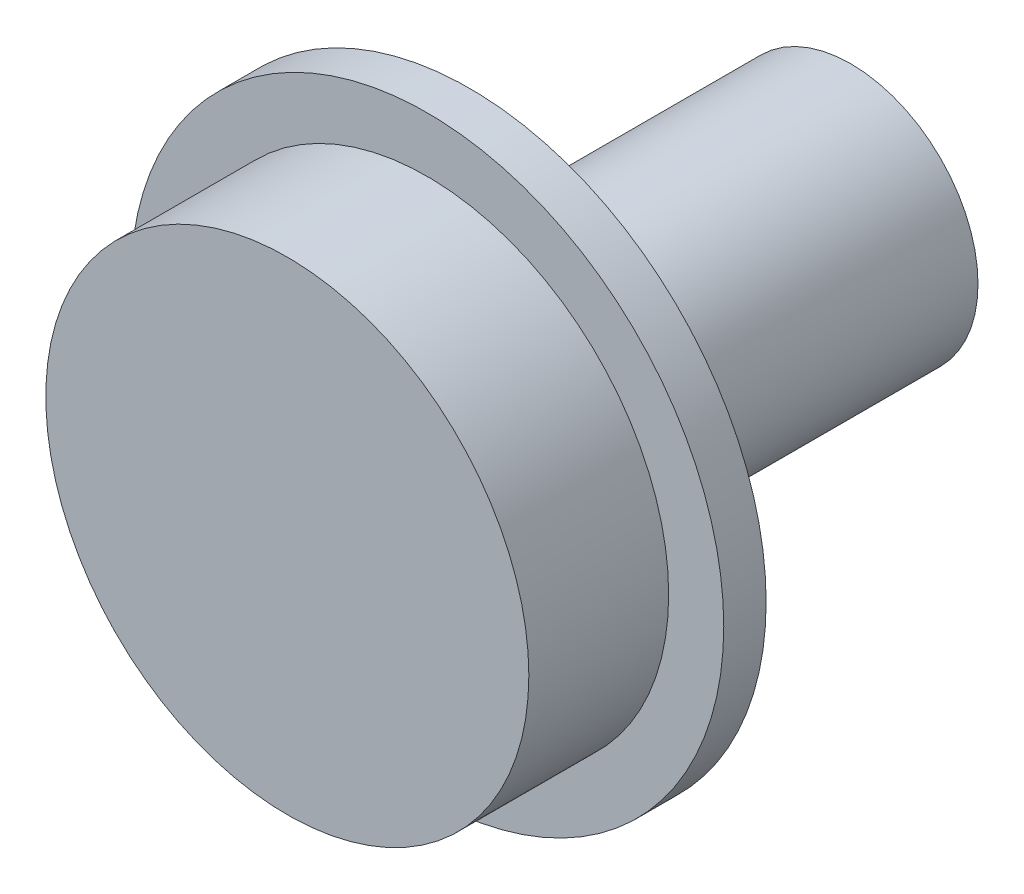
ISO-10303-21;
HEADER;
FILE_DESCRIPTION(('STEP AP214'),'2;1');
FILE_NAME('part.step','',(''),(''),'','','');
FILE_SCHEMA(('AUTOMOTIVE_DESIGN { 1 0 10303 214 1 1 1 1 }'));
ENDSEC;
DATA;
#1=APPLICATION_CONTEXT('core data for automotive mechanical design processes');
#2=APPLICATION_PROTOCOL_DEFINITION('international standard','automotive_design',2000,#1);
#3=PRODUCT_CONTEXT('',#1,'mechanical');
#4=PRODUCT('Part','Part','',(#3));
#5=PRODUCT_RELATED_PRODUCT_CATEGORY('part','',(#4));
#6=PRODUCT_DEFINITION_FORMATION('','',#4);
#7=PRODUCT_DEFINITION_CONTEXT('part definition',#1,'design');
#8=PRODUCT_DEFINITION('design','',#6,#7);
#9=PRODUCT_DEFINITION_SHAPE('','',#8);
#10=(LENGTH_UNIT() NAMED_UNIT(*) SI_UNIT(.MILLI.,.METRE.));
#11=(NAMED_UNIT(*) PLANE_ANGLE_UNIT() SI_UNIT($,.RADIAN.));
#12=(NAMED_UNIT(*) SI_UNIT($,.STERADIAN.) SOLID_ANGLE_UNIT());
#13=UNCERTAINTY_MEASURE_WITH_UNIT(LENGTH_MEASURE(1.E-05),#10,'distance_accuracy_value','');
#14=(GEOMETRIC_REPRESENTATION_CONTEXT(3) GLOBAL_UNCERTAINTY_ASSIGNED_CONTEXT((#13)) GLOBAL_UNIT_ASSIGNED_CONTEXT((#10,
#11,#12)) REPRESENTATION_CONTEXT('',''));
#15=CARTESIAN_POINT('',(0.,0.,0.));
#16=DIRECTION('',(0.,0.,1.));
#17=DIRECTION('',(1.,0.,0.));
#18=AXIS2_PLACEMENT_3D('',#15,#16,#17);
#19=CARTESIAN_POINT('',(0.,0.,0.5));
#20=DIRECTION('',(0.,0.,1.));
#21=DIRECTION('',(1.,0.,0.));
#22=AXIS2_PLACEMENT_3D('',#19,#20,#21);
#23=PLANE('',#22);
#24=CARTESIAN_POINT('',(0.,0.,0.5));
#25=DIRECTION('',(0.,0.,1.));
#26=DIRECTION('',(1.,0.,0.));
#27=AXIS2_PLACEMENT_3D('',#24,#25,#26);
#28=CIRCLE('',#27,1.5);
#29=CARTESIAN_POINT('',(1.5,0.,0.5));
#30=VERTEX_POINT('',#29);
#31=EDGE_CURVE('E44',#30,#30,#28,.T.);
#32=ORIENTED_EDGE('',*,*,#31,.T.);
#33=EDGE_LOOP('',(#32));
#34=FACE_BOUND('',#33,.T.);
#35=CARTESIAN_POINT('',(0.,0.,0.5));
#36=DIRECTION('',(0.,0.,1.));
#37=DIRECTION('',(1.,0.,0.));
#38=AXIS2_PLACEMENT_3D('',#35,#36,#37);
#39=CIRCLE('',#38,1.7);
#40=CARTESIAN_POINT('',(1.7,0.,0.5));
#41=VERTEX_POINT('',#40);
#42=EDGE_CURVE('E61',#41,#41,#39,.T.);
#43=ORIENTED_EDGE('',*,*,#42,.F.);
#44=EDGE_LOOP('',(#43));
#45=FACE_BOUND('',#44,.T.);
#46=ADVANCED_FACE('F37',(#34,#45),#23,.F.);
#47=CARTESIAN_POINT('',(0.,0.,0.5));
#48=DIRECTION('',(0.,0.,-1.));
#49=DIRECTION('',(-1.,0.,0.));
#50=AXIS2_PLACEMENT_3D('',#47,#48,#49);
#51=CYLINDRICAL_SURFACE('',#50,1.5);
#52=ORIENTED_EDGE('',*,*,#31,.F.);
#53=EDGE_LOOP('',(#52));
#54=FACE_BOUND('',#53,.T.);
#55=CARTESIAN_POINT('',(0.,0.,-4.5));
#56=DIRECTION('',(0.,0.,1.));
#57=DIRECTION('',(1.,0.,0.));
#58=AXIS2_PLACEMENT_3D('',#55,#56,#57);
#59=CIRCLE('',#58,1.5);
#60=CARTESIAN_POINT('',(1.5,0.,-4.5));
#61=VERTEX_POINT('',#60);
#62=EDGE_CURVE('E48',#61,#61,#59,.T.);
#63=ORIENTED_EDGE('',*,*,#62,.T.);
#64=EDGE_LOOP('',(#63));
#65=FACE_BOUND('',#64,.T.);
#66=ADVANCED_FACE('F74',(#54,#65),#51,.T.);
#67=CARTESIAN_POINT('',(0.,0.,-4.5));
#68=DIRECTION('',(0.,0.,1.));
#69=DIRECTION('',(1.,0.,0.));
#70=AXIS2_PLACEMENT_3D('',#67,#68,#69);
#71=PLANE('',#70);
#72=ORIENTED_EDGE('',*,*,#62,.F.);
#73=EDGE_LOOP('',(#72));
#74=FACE_BOUND('',#73,.T.);
#75=ADVANCED_FACE('F80',(#74),#71,.F.);
#76=CARTESIAN_POINT('',(0.,0.,0.5));
#77=DIRECTION('',(0.,0.,1.));
#78=DIRECTION('',(1.,0.,0.));
#79=AXIS2_PLACEMENT_3D('',#76,#77,#78);
#80=PLANE('',#79);
#81=CARTESIAN_POINT('',(0.,0.,0.5));
#82=DIRECTION('',(0.,0.,1.));
#83=DIRECTION('',(1.,0.,0.));
#84=AXIS2_PLACEMENT_3D('',#81,#82,#83);
#85=CIRCLE('',#84,2.85);
#86=CARTESIAN_POINT('',(2.85,0.,0.5));
#87=VERTEX_POINT('',#86);
#88=EDGE_CURVE('E53',#87,#87,#85,.T.);
#89=ORIENTED_EDGE('',*,*,#88,.F.);
#90=EDGE_LOOP('',(#89));
#91=FACE_BOUND('',#90,.T.);
#92=CARTESIAN_POINT('',(0.,0.,0.5));
#93=DIRECTION('',(0.,0.,1.));
#94=DIRECTION('',(1.,0.,0.));
#95=AXIS2_PLACEMENT_3D('',#92,#93,#94);
#96=CIRCLE('',#95,3.5);
#97=CARTESIAN_POINT('',(3.5,0.,0.5));
#98=VERTEX_POINT('',#97);
#99=EDGE_CURVE('E57',#98,#98,#96,.T.);
#100=ORIENTED_EDGE('',*,*,#99,.T.);
#101=EDGE_LOOP('',(#100));
#102=FACE_BOUND('',#101,.T.);
#103=ADVANCED_FACE('F88',(#91,#102),#80,.T.);
#104=CARTESIAN_POINT('',(0.,0.,0.));
#105=DIRECTION('',(0.,0.,1.));
#106=DIRECTION('',(1.,0.,0.));
#107=AXIS2_PLACEMENT_3D('',#104,#105,#106);
#108=PLANE('',#107);
#109=CARTESIAN_POINT('',(0.,0.,0.));
#110=DIRECTION('',(0.,0.,1.));
#111=DIRECTION('',(1.,0.,0.));
#112=AXIS2_PLACEMENT_3D('',#109,#110,#111);
#113=CIRCLE('',#112,3.5);
#114=CARTESIAN_POINT('',(3.5,0.,0.));
#115=VERTEX_POINT('',#114);
#116=EDGE_CURVE('E58',#115,#115,#113,.T.);
#117=ORIENTED_EDGE('',*,*,#116,.F.);
#118=EDGE_LOOP('',(#117));
#119=FACE_BOUND('',#118,.T.);
#120=CARTESIAN_POINT('',(0.,0.,0.));
#121=DIRECTION('',(0.,0.,1.));
#122=DIRECTION('',(1.,0.,0.));
#123=AXIS2_PLACEMENT_3D('',#120,#121,#122);
#124=CIRCLE('',#123,1.7);
#125=CARTESIAN_POINT('',(1.7,0.,0.));
#126=VERTEX_POINT('',#125);
#127=EDGE_CURVE('E64',#126,#126,#124,.T.);
#128=ORIENTED_EDGE('',*,*,#127,.T.);
#129=EDGE_LOOP('',(#128));
#130=FACE_BOUND('',#129,.T.);
#131=ADVANCED_FACE('F93',(#119,#130),#108,.F.);
#132=CARTESIAN_POINT('',(0.,0.,0.5));
#133=DIRECTION('',(0.,0.,-1.));
#134=DIRECTION('',(-1.,0.,0.));
#135=AXIS2_PLACEMENT_3D('',#132,#133,#134);
#136=CYLINDRICAL_SURFACE('',#135,3.5);
#137=ORIENTED_EDGE('',*,*,#99,.F.);
#138=EDGE_LOOP('',(#137));
#139=FACE_BOUND('',#138,.T.);
#140=ORIENTED_EDGE('',*,*,#116,.T.);
#141=EDGE_LOOP('',(#140));
#142=FACE_BOUND('',#141,.T.);
#143=ADVANCED_FACE('F90',(#139,#142),#136,.T.);
#144=CARTESIAN_POINT('',(0.,0.,0.5));
#145=DIRECTION('',(0.,0.,-1.));
#146=DIRECTION('',(-1.,0.,0.));
#147=AXIS2_PLACEMENT_3D('',#144,#145,#146);
#148=CYLINDRICAL_SURFACE('',#147,1.7);
#149=ORIENTED_EDGE('',*,*,#42,.T.);
#150=EDGE_LOOP('',(#149));
#151=FACE_BOUND('',#150,.T.);
#152=ORIENTED_EDGE('',*,*,#127,.F.);
#153=EDGE_LOOP('',(#152));
#154=FACE_BOUND('',#153,.T.);
#155=ADVANCED_FACE('F70',(#151,#154),#148,.F.);
#156=CARTESIAN_POINT('',(0.,0.,2.15));
#157=DIRECTION('',(0.,0.,1.));
#158=DIRECTION('',(1.,0.,0.));
#159=AXIS2_PLACEMENT_3D('',#156,#157,#158);
#160=PLANE('',#159);
#161=CARTESIAN_POINT('',(0.,0.,2.15));
#162=DIRECTION('',(0.,0.,1.));
#163=DIRECTION('',(1.,0.,0.));
#164=AXIS2_PLACEMENT_3D('',#161,#162,#163);
#165=CIRCLE('',#164,2.85);
#166=CARTESIAN_POINT('',(2.85,0.,2.15));
#167=VERTEX_POINT('',#166);
#168=EDGE_CURVE('E10',#167,#167,#165,.T.);
#169=ORIENTED_EDGE('',*,*,#168,.T.);
#170=EDGE_LOOP('',(#169));
#171=FACE_BOUND('',#170,.T.);
#172=ADVANCED_FACE('F84',(#171),#160,.T.);
#173=CARTESIAN_POINT('',(0.,0.,2.15));
#174=DIRECTION('',(0.,0.,-1.));
#175=DIRECTION('',(-1.,0.,0.));
#176=AXIS2_PLACEMENT_3D('',#173,#174,#175);
#177=CYLINDRICAL_SURFACE('',#176,2.85);
#178=ORIENTED_EDGE('',*,*,#168,.F.);
#179=EDGE_LOOP('',(#178));
#180=FACE_BOUND('',#179,.T.);
#181=ORIENTED_EDGE('',*,*,#88,.T.);
#182=EDGE_LOOP('',(#181));
#183=FACE_BOUND('',#182,.T.);
#184=ADVANCED_FACE('F39',(#180,#183),#177,.T.);
#185=CLOSED_SHELL('',(#46,#66,#75,#103,#131,#143,#155,#172,#184));
#186=MANIFOLD_SOLID_BREP('B2',#185);
#187=ADVANCED_BREP_SHAPE_REPRESENTATION('',(#18,#186),#14);
#188=SHAPE_DEFINITION_REPRESENTATION(#9,#187);
ENDSEC;
END-ISO-10303-21;
